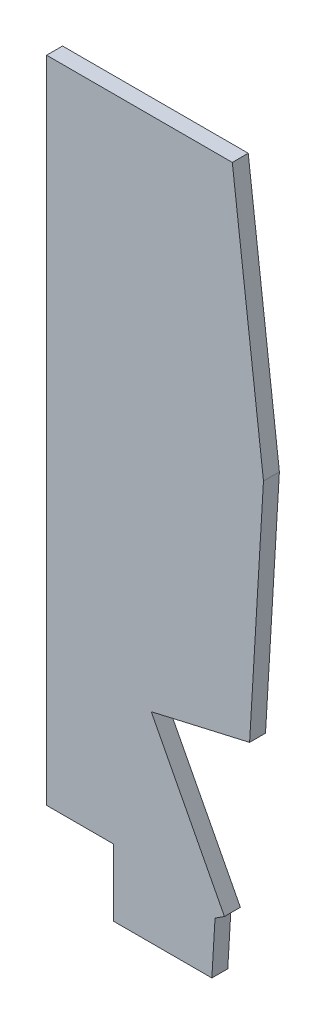
ISO-10303-21;
HEADER;
FILE_DESCRIPTION(('STEP AP214'),'2;1');
FILE_NAME('part.step','',(''),(''),'','','');
FILE_SCHEMA(('AUTOMOTIVE_DESIGN { 1 0 10303 214 1 1 1 1 }'));
ENDSEC;
DATA;
#1=APPLICATION_CONTEXT('core data for automotive mechanical design processes');
#2=APPLICATION_PROTOCOL_DEFINITION('international standard','automotive_design',2000,#1);
#3=PRODUCT_CONTEXT('',#1,'mechanical');
#4=PRODUCT('Part','Part','',(#3));
#5=PRODUCT_RELATED_PRODUCT_CATEGORY('part','',(#4));
#6=PRODUCT_DEFINITION_FORMATION('','',#4);
#7=PRODUCT_DEFINITION_CONTEXT('part definition',#1,'design');
#8=PRODUCT_DEFINITION('design','',#6,#7);
#9=PRODUCT_DEFINITION_SHAPE('','',#8);
#10=(LENGTH_UNIT() NAMED_UNIT(*) SI_UNIT(.MILLI.,.METRE.));
#11=(NAMED_UNIT(*) PLANE_ANGLE_UNIT() SI_UNIT($,.RADIAN.));
#12=(NAMED_UNIT(*) SI_UNIT($,.STERADIAN.) SOLID_ANGLE_UNIT());
#13=UNCERTAINTY_MEASURE_WITH_UNIT(LENGTH_MEASURE(1.E-05),#10,'distance_accuracy_value','');
#14=(GEOMETRIC_REPRESENTATION_CONTEXT(3) GLOBAL_UNCERTAINTY_ASSIGNED_CONTEXT((#13)) GLOBAL_UNIT_ASSIGNED_CONTEXT((#10,
#11,#12)) REPRESENTATION_CONTEXT('',''));
#15=CARTESIAN_POINT('',(0.,0.,0.));
#16=DIRECTION('',(0.,0.,1.));
#17=DIRECTION('',(1.,0.,0.));
#18=AXIS2_PLACEMENT_3D('',#15,#16,#17);
#19=CARTESIAN_POINT('',(-100.,112.5,5.));
#20=DIRECTION('',(0.,-1.,0.));
#21=DIRECTION('',(0.,0.,-1.));
#22=AXIS2_PLACEMENT_3D('',#19,#20,#21);
#23=PLANE('',#22);
#24=DIRECTION('',(-1.,0.,0.));
#25=VECTOR('',#24,1.);
#26=CARTESIAN_POINT('',(-100.,112.5,5.));
#27=LINE('',#26,#25);
#28=CARTESIAN_POINT('',(-41.6890144098652,112.5,5.));
#29=VERTEX_POINT('',#28);
#30=CARTESIAN_POINT('',(-100.,112.5,5.));
#31=VERTEX_POINT('',#30);
#32=EDGE_CURVE('E131',#29,#31,#27,.T.);
#33=ORIENTED_EDGE('',*,*,#32,.F.);
#34=DIRECTION('',(0.,0.,1.));
#35=VECTOR('',#34,1.);
#36=CARTESIAN_POINT('',(-41.6890144098652,112.5,0.));
#37=LINE('',#36,#35);
#38=CARTESIAN_POINT('',(-41.6890144098652,112.5,0.));
#39=VERTEX_POINT('',#38);
#40=EDGE_CURVE('E120',#39,#29,#37,.T.);
#41=ORIENTED_EDGE('',*,*,#40,.F.);
#42=DIRECTION('',(-1.,0.,0.));
#43=VECTOR('',#42,1.);
#44=CARTESIAN_POINT('',(-100.,112.5,0.));
#45=LINE('',#44,#43);
#46=CARTESIAN_POINT('',(-100.,112.5,0.));
#47=VERTEX_POINT('',#46);
#48=EDGE_CURVE('E130',#39,#47,#45,.T.);
#49=ORIENTED_EDGE('',*,*,#48,.T.);
#50=DIRECTION('',(0.,0.,-1.));
#51=VECTOR('',#50,1.);
#52=CARTESIAN_POINT('',(-100.,112.5,5.));
#53=LINE('',#52,#51);
#54=EDGE_CURVE('E11',#31,#47,#53,.T.);
#55=ORIENTED_EDGE('',*,*,#54,.F.);
#56=EDGE_LOOP('',(#33,#41,#49,#55));
#57=FACE_BOUND('',#56,.T.);
#58=ADVANCED_FACE('F35',(#57),#23,.F.);
#59=CARTESIAN_POINT('',(-100.,112.5,5.));
#60=DIRECTION('',(1.,0.,0.));
#61=DIRECTION('',(0.,1.,0.));
#62=AXIS2_PLACEMENT_3D('',#59,#60,#61);
#63=PLANE('',#62);
#64=DIRECTION('',(0.,-1.,0.));
#65=VECTOR('',#64,1.);
#66=CARTESIAN_POINT('',(-100.,112.5,0.));
#67=LINE('',#66,#65);
#68=CARTESIAN_POINT('',(-100.,-91.5,0.));
#69=VERTEX_POINT('',#68);
#70=EDGE_CURVE('E138',#47,#69,#67,.T.);
#71=ORIENTED_EDGE('',*,*,#70,.T.);
#72=DIRECTION('',(0.,0.,1.));
#73=VECTOR('',#72,1.);
#74=CARTESIAN_POINT('',(-100.,-91.5,0.));
#75=LINE('',#74,#73);
#76=CARTESIAN_POINT('',(-100.,-91.5,5.));
#77=VERTEX_POINT('',#76);
#78=EDGE_CURVE('E139',#69,#77,#75,.T.);
#79=ORIENTED_EDGE('',*,*,#78,.T.);
#80=DIRECTION('',(0.,-1.,0.));
#81=VECTOR('',#80,1.);
#82=CARTESIAN_POINT('',(-100.,112.5,5.));
#83=LINE('',#82,#81);
#84=EDGE_CURVE('E153',#31,#77,#83,.T.);
#85=ORIENTED_EDGE('',*,*,#84,.F.);
#86=ORIENTED_EDGE('',*,*,#54,.T.);
#87=EDGE_LOOP('',(#71,#79,#85,#86));
#88=FACE_BOUND('',#87,.T.);
#89=ADVANCED_FACE('F231',(#88),#63,.F.);
#90=CARTESIAN_POINT('',(-100.,-112.5,5.));
#91=DIRECTION('',(0.,1.,0.));
#92=DIRECTION('',(0.,0.,1.));
#93=AXIS2_PLACEMENT_3D('',#90,#91,#92);
#94=PLANE('',#93);
#95=DIRECTION('',(1.,0.,0.));
#96=VECTOR('',#95,1.);
#97=CARTESIAN_POINT('',(-100.,-112.5,0.));
#98=LINE('',#97,#96);
#99=CARTESIAN_POINT('',(-79.,-112.5,0.));
#100=VERTEX_POINT('',#99);
#101=CARTESIAN_POINT('',(-48.1142635898387,-112.5,0.));
#102=VERTEX_POINT('',#101);
#103=EDGE_CURVE('E141',#100,#102,#98,.T.);
#104=ORIENTED_EDGE('',*,*,#103,.T.);
#105=DIRECTION('',(0.,0.,1.));
#106=VECTOR('',#105,1.);
#107=CARTESIAN_POINT('',(-48.1142635898387,-112.5,0.));
#108=LINE('',#107,#106);
#109=CARTESIAN_POINT('',(-48.1142635898387,-112.5,5.));
#110=VERTEX_POINT('',#109);
#111=EDGE_CURVE('E167',#102,#110,#108,.T.);
#112=ORIENTED_EDGE('',*,*,#111,.T.);
#113=DIRECTION('',(1.,0.,0.));
#114=VECTOR('',#113,1.);
#115=CARTESIAN_POINT('',(-100.,-112.5,5.));
#116=LINE('',#115,#114);
#117=CARTESIAN_POINT('',(-79.,-112.5,5.));
#118=VERTEX_POINT('',#117);
#119=EDGE_CURVE('E42',#118,#110,#116,.T.);
#120=ORIENTED_EDGE('',*,*,#119,.F.);
#121=DIRECTION('',(0.,0.,1.));
#122=VECTOR('',#121,1.);
#123=CARTESIAN_POINT('',(-79.,-112.5,0.));
#124=LINE('',#123,#122);
#125=EDGE_CURVE('E158',#100,#118,#124,.T.);
#126=ORIENTED_EDGE('',*,*,#125,.F.);
#127=EDGE_LOOP('',(#104,#112,#120,#126));
#128=FACE_BOUND('',#127,.T.);
#129=ADVANCED_FACE('F224',(#128),#94,.F.);
#130=CARTESIAN_POINT('',(0.,0.,5.));
#131=DIRECTION('',(0.,0.,1.));
#132=DIRECTION('',(1.,0.,0.));
#133=AXIS2_PLACEMENT_3D('',#130,#131,#132);
#134=PLANE('',#133);
#135=DIRECTION('',(-0.0594132195889589,-0.998233474362623,0.));
#136=VECTOR('',#135,1.);
#137=CARTESIAN_POINT('',(-47.1150766417989,-95.712122393298,5.));
#138=LINE('',#137,#136);
#139=CARTESIAN_POINT('',(-47.1150766417989,-95.712122393298,5.));
#140=VERTEX_POINT('',#139);
#141=EDGE_CURVE('E125',#140,#110,#138,.T.);
#142=ORIENTED_EDGE('',*,*,#141,.F.);
#143=DIRECTION('',(-0.839812379223764,-0.542876751853052,0.));
#144=VECTOR('',#143,1.);
#145=CARTESIAN_POINT('',(-47.1150766417989,-95.712122393298,5.));
#146=LINE('',#145,#144);
#147=CARTESIAN_POINT('',(-44.1550648933672,-93.7986931522087,5.));
#148=VERTEX_POINT('',#147);
#149=EDGE_CURVE('E182',#148,#140,#146,.T.);
#150=ORIENTED_EDGE('',*,*,#149,.F.);
#151=DIRECTION('',(0.46142293928003,-0.887180292334189,0.));
#152=VECTOR('',#151,1.);
#153=CARTESIAN_POINT('',(-44.1550648933672,-93.7986931522087,5.));
#154=LINE('',#153,#152);
#155=CARTESIAN_POINT('',(-67.1447556794238,-49.5962947537443,5.));
#156=VERTEX_POINT('',#155);
#157=EDGE_CURVE('E185',#156,#148,#154,.T.);
#158=ORIENTED_EDGE('',*,*,#157,.F.);
#159=DIRECTION('',(-0.974634387731809,-0.223803061307573,0.));
#160=VECTOR('',#159,1.);
#161=CARTESIAN_POINT('',(-67.1447556794238,-49.5962947537443,5.));
#162=LINE('',#161,#160);
#163=CARTESIAN_POINT('',(-36.2629521779314,-42.5049769741435,5.));
#164=VERTEX_POINT('',#163);
#165=EDGE_CURVE('E188',#164,#156,#162,.T.);
#166=ORIENTED_EDGE('',*,*,#165,.F.);
#167=DIRECTION('',(-0.0594132195889583,-0.998233474362623,0.));
#168=VECTOR('',#167,1.);
#169=CARTESIAN_POINT('',(-36.2629521779314,-42.5049769741435,5.));
#170=LINE('',#169,#168);
#171=CARTESIAN_POINT('',(-31.9026723474871,30.7544308554668,5.));
#172=VERTEX_POINT('',#171);
#173=EDGE_CURVE('E191',#172,#164,#170,.T.);
#174=ORIENTED_EDGE('',*,*,#173,.F.);
#175=DIRECTION('',(0.118868304244425,-0.992910029280627,0.));
#176=VECTOR('',#175,1.);
#177=CARTESIAN_POINT('',(-31.9026723474871,30.7544308554668,5.));
#178=LINE('',#177,#176);
#179=EDGE_CURVE('E194',#29,#172,#178,.T.);
#180=ORIENTED_EDGE('',*,*,#179,.F.);
#181=ORIENTED_EDGE('',*,*,#32,.T.);
#182=ORIENTED_EDGE('',*,*,#84,.T.);
#183=DIRECTION('',(-1.,0.,0.));
#184=VECTOR('',#183,1.);
#185=CARTESIAN_POINT('',(-100.,-91.5,5.));
#186=LINE('',#185,#184);
#187=CARTESIAN_POINT('',(-79.,-91.5,5.));
#188=VERTEX_POINT('',#187);
#189=EDGE_CURVE('E161',#188,#77,#186,.T.);
#190=ORIENTED_EDGE('',*,*,#189,.F.);
#191=DIRECTION('',(0.,1.,0.));
#192=VECTOR('',#191,1.);
#193=CARTESIAN_POINT('',(-79.,-112.5,5.));
#194=LINE('',#193,#192);
#195=EDGE_CURVE('E164',#118,#188,#194,.T.);
#196=ORIENTED_EDGE('',*,*,#195,.F.);
#197=ORIENTED_EDGE('',*,*,#119,.T.);
#198=EDGE_LOOP('',(#142,#150,#158,#166,#174,#180,#181,#182,#190,#196,#197));
#199=FACE_BOUND('',#198,.T.);
#200=ADVANCED_FACE('F226',(#199),#134,.T.);
#201=CARTESIAN_POINT('',(0.,0.,0.));
#202=DIRECTION('',(0.,0.,1.));
#203=DIRECTION('',(1.,0.,0.));
#204=AXIS2_PLACEMENT_3D('',#201,#202,#203);
#205=PLANE('',#204);
#206=DIRECTION('',(-0.839812379223764,-0.542876751853052,0.));
#207=VECTOR('',#206,1.);
#208=CARTESIAN_POINT('',(-47.1150766417989,-95.712122393298,0.));
#209=LINE('',#208,#207);
#210=CARTESIAN_POINT('',(-44.1550648933672,-93.7986931522087,0.));
#211=VERTEX_POINT('',#210);
#212=CARTESIAN_POINT('',(-47.1150766417989,-95.712122393298,0.));
#213=VERTEX_POINT('',#212);
#214=EDGE_CURVE('E198',#211,#213,#209,.T.);
#215=ORIENTED_EDGE('',*,*,#214,.T.);
#216=DIRECTION('',(-0.0594132195889589,-0.998233474362623,0.));
#217=VECTOR('',#216,1.);
#218=CARTESIAN_POINT('',(-47.1150766417989,-95.712122393298,0.));
#219=LINE('',#218,#217);
#220=EDGE_CURVE('E132',#213,#102,#219,.T.);
#221=ORIENTED_EDGE('',*,*,#220,.T.);
#222=ORIENTED_EDGE('',*,*,#103,.F.);
#223=DIRECTION('',(0.,1.,0.));
#224=VECTOR('',#223,1.);
#225=CARTESIAN_POINT('',(-79.,-112.5,0.));
#226=LINE('',#225,#224);
#227=CARTESIAN_POINT('',(-79.,-91.5,0.));
#228=VERTEX_POINT('',#227);
#229=EDGE_CURVE('E163',#100,#228,#226,.T.);
#230=ORIENTED_EDGE('',*,*,#229,.T.);
#231=DIRECTION('',(-1.,0.,0.));
#232=VECTOR('',#231,1.);
#233=CARTESIAN_POINT('',(-100.,-91.5,0.));
#234=LINE('',#233,#232);
#235=EDGE_CURVE('E57',#228,#69,#234,.T.);
#236=ORIENTED_EDGE('',*,*,#235,.T.);
#237=ORIENTED_EDGE('',*,*,#70,.F.);
#238=ORIENTED_EDGE('',*,*,#48,.F.);
#239=DIRECTION('',(0.118868304244425,-0.992910029280627,0.));
#240=VECTOR('',#239,1.);
#241=CARTESIAN_POINT('',(-31.9026723474871,30.7544308554668,0.));
#242=LINE('',#241,#240);
#243=CARTESIAN_POINT('',(-31.9026723474871,30.7544308554668,0.));
#244=VERTEX_POINT('',#243);
#245=EDGE_CURVE('E116',#39,#244,#242,.T.);
#246=ORIENTED_EDGE('',*,*,#245,.T.);
#247=DIRECTION('',(-0.0594132195889583,-0.998233474362623,0.));
#248=VECTOR('',#247,1.);
#249=CARTESIAN_POINT('',(-36.2629521779314,-42.5049769741435,0.));
#250=LINE('',#249,#248);
#251=CARTESIAN_POINT('',(-36.2629521779314,-42.5049769741435,0.));
#252=VERTEX_POINT('',#251);
#253=EDGE_CURVE('E49',#244,#252,#250,.T.);
#254=ORIENTED_EDGE('',*,*,#253,.T.);
#255=DIRECTION('',(-0.974634387731809,-0.223803061307573,0.));
#256=VECTOR('',#255,1.);
#257=CARTESIAN_POINT('',(-67.1447556794238,-49.5962947537443,0.));
#258=LINE('',#257,#256);
#259=CARTESIAN_POINT('',(-67.1447556794238,-49.5962947537443,0.));
#260=VERTEX_POINT('',#259);
#261=EDGE_CURVE('E203',#252,#260,#258,.T.);
#262=ORIENTED_EDGE('',*,*,#261,.T.);
#263=DIRECTION('',(0.46142293928003,-0.887180292334189,0.));
#264=VECTOR('',#263,1.);
#265=CARTESIAN_POINT('',(-44.1550648933672,-93.7986931522087,0.));
#266=LINE('',#265,#264);
#267=EDGE_CURVE('E200',#260,#211,#266,.T.);
#268=ORIENTED_EDGE('',*,*,#267,.T.);
#269=EDGE_LOOP('',(#215,#221,#222,#230,#236,#237,#238,#246,#254,#262,#268));
#270=FACE_BOUND('',#269,.T.);
#271=ADVANCED_FACE('F136',(#270),#205,.F.);
#272=CARTESIAN_POINT('',(-100.,-91.5,0.));
#273=DIRECTION('',(0.,1.,0.));
#274=DIRECTION('',(0.,0.,1.));
#275=AXIS2_PLACEMENT_3D('',#272,#273,#274);
#276=PLANE('',#275);
#277=ORIENTED_EDGE('',*,*,#189,.T.);
#278=ORIENTED_EDGE('',*,*,#78,.F.);
#279=ORIENTED_EDGE('',*,*,#235,.F.);
#280=DIRECTION('',(0.,0.,1.));
#281=VECTOR('',#280,1.);
#282=CARTESIAN_POINT('',(-79.,-91.5,0.));
#283=LINE('',#282,#281);
#284=EDGE_CURVE('E144',#228,#188,#283,.T.);
#285=ORIENTED_EDGE('',*,*,#284,.T.);
#286=EDGE_LOOP('',(#277,#278,#279,#285));
#287=FACE_BOUND('',#286,.T.);
#288=ADVANCED_FACE('F233',(#287),#276,.F.);
#289=CARTESIAN_POINT('',(-79.,-112.5,0.));
#290=DIRECTION('',(1.,0.,0.));
#291=DIRECTION('',(0.,0.,-1.));
#292=AXIS2_PLACEMENT_3D('',#289,#290,#291);
#293=PLANE('',#292);
#294=ORIENTED_EDGE('',*,*,#195,.T.);
#295=ORIENTED_EDGE('',*,*,#284,.F.);
#296=ORIENTED_EDGE('',*,*,#229,.F.);
#297=ORIENTED_EDGE('',*,*,#125,.T.);
#298=EDGE_LOOP('',(#294,#295,#296,#297));
#299=FACE_BOUND('',#298,.T.);
#300=ADVANCED_FACE('F229',(#299),#293,.F.);
#301=CARTESIAN_POINT('',(-47.1150766417989,-95.712122393298,0.));
#302=DIRECTION('',(-0.998233474362623,0.0594132195889589,0.));
#303=DIRECTION('',(-0.0594132195889589,-0.998233474362623,0.));
#304=AXIS2_PLACEMENT_3D('',#301,#302,#303);
#305=PLANE('',#304);
#306=ORIENTED_EDGE('',*,*,#141,.T.);
#307=ORIENTED_EDGE('',*,*,#111,.F.);
#308=ORIENTED_EDGE('',*,*,#220,.F.);
#309=DIRECTION('',(0.,0.,1.));
#310=VECTOR('',#309,1.);
#311=CARTESIAN_POINT('',(-47.1150766417989,-95.712122393298,0.));
#312=LINE('',#311,#310);
#313=EDGE_CURVE('E178',#213,#140,#312,.T.);
#314=ORIENTED_EDGE('',*,*,#313,.T.);
#315=EDGE_LOOP('',(#306,#307,#308,#314));
#316=FACE_BOUND('',#315,.T.);
#317=ADVANCED_FACE('F220',(#316),#305,.F.);
#318=CARTESIAN_POINT('',(-47.1150766417989,-95.712122393298,0.));
#319=DIRECTION('',(-0.542876751853052,0.839812379223764,0.));
#320=DIRECTION('',(-0.839812379223764,-0.542876751853052,0.));
#321=AXIS2_PLACEMENT_3D('',#318,#319,#320);
#322=PLANE('',#321);
#323=ORIENTED_EDGE('',*,*,#149,.T.);
#324=ORIENTED_EDGE('',*,*,#313,.F.);
#325=ORIENTED_EDGE('',*,*,#214,.F.);
#326=DIRECTION('',(0.,0.,1.));
#327=VECTOR('',#326,1.);
#328=CARTESIAN_POINT('',(-44.1550648933672,-93.7986931522087,0.));
#329=LINE('',#328,#327);
#330=EDGE_CURVE('E176',#211,#148,#329,.T.);
#331=ORIENTED_EDGE('',*,*,#330,.T.);
#332=EDGE_LOOP('',(#323,#324,#325,#331));
#333=FACE_BOUND('',#332,.T.);
#334=ADVANCED_FACE('F217',(#333),#322,.F.);
#335=CARTESIAN_POINT('',(-44.1550648933672,-93.7986931522087,0.));
#336=DIRECTION('',(-0.887180292334189,-0.46142293928003,0.));
#337=DIRECTION('',(0.46142293928003,-0.887180292334189,0.));
#338=AXIS2_PLACEMENT_3D('',#335,#336,#337);
#339=PLANE('',#338);
#340=ORIENTED_EDGE('',*,*,#157,.T.);
#341=ORIENTED_EDGE('',*,*,#330,.F.);
#342=ORIENTED_EDGE('',*,*,#267,.F.);
#343=DIRECTION('',(0.,0.,1.));
#344=VECTOR('',#343,1.);
#345=CARTESIAN_POINT('',(-67.1447556794238,-49.5962947537443,0.));
#346=LINE('',#345,#344);
#347=EDGE_CURVE('E174',#260,#156,#346,.T.);
#348=ORIENTED_EDGE('',*,*,#347,.T.);
#349=EDGE_LOOP('',(#340,#341,#342,#348));
#350=FACE_BOUND('',#349,.T.);
#351=ADVANCED_FACE('F213',(#350),#339,.F.);
#352=CARTESIAN_POINT('',(-67.1447556794238,-49.5962947537443,0.));
#353=DIRECTION('',(-0.223803061307573,0.974634387731809,0.));
#354=DIRECTION('',(-0.974634387731809,-0.223803061307573,0.));
#355=AXIS2_PLACEMENT_3D('',#352,#353,#354);
#356=PLANE('',#355);
#357=ORIENTED_EDGE('',*,*,#165,.T.);
#358=ORIENTED_EDGE('',*,*,#347,.F.);
#359=ORIENTED_EDGE('',*,*,#261,.F.);
#360=DIRECTION('',(0.,0.,1.));
#361=VECTOR('',#360,1.);
#362=CARTESIAN_POINT('',(-36.2629521779314,-42.5049769741435,0.));
#363=LINE('',#362,#361);
#364=EDGE_CURVE('E172',#252,#164,#363,.T.);
#365=ORIENTED_EDGE('',*,*,#364,.T.);
#366=EDGE_LOOP('',(#357,#358,#359,#365));
#367=FACE_BOUND('',#366,.T.);
#368=ADVANCED_FACE('F209',(#367),#356,.F.);
#369=CARTESIAN_POINT('',(-36.2629521779314,-42.5049769741435,0.));
#370=DIRECTION('',(-0.998233474362623,0.0594132195889583,0.));
#371=DIRECTION('',(-0.0594132195889583,-0.998233474362623,0.));
#372=AXIS2_PLACEMENT_3D('',#369,#370,#371);
#373=PLANE('',#372);
#374=ORIENTED_EDGE('',*,*,#173,.T.);
#375=ORIENTED_EDGE('',*,*,#364,.F.);
#376=ORIENTED_EDGE('',*,*,#253,.F.);
#377=DIRECTION('',(0.,0.,1.));
#378=VECTOR('',#377,1.);
#379=CARTESIAN_POINT('',(-31.9026723474871,30.7544308554668,0.));
#380=LINE('',#379,#378);
#381=EDGE_CURVE('E122',#244,#172,#380,.T.);
#382=ORIENTED_EDGE('',*,*,#381,.T.);
#383=EDGE_LOOP('',(#374,#375,#376,#382));
#384=FACE_BOUND('',#383,.T.);
#385=ADVANCED_FACE('F296',(#384),#373,.F.);
#386=CARTESIAN_POINT('',(-31.9026723474871,30.7544308554668,0.));
#387=DIRECTION('',(-0.992910029280627,-0.118868304244425,0.));
#388=DIRECTION('',(0.118868304244425,-0.992910029280627,0.));
#389=AXIS2_PLACEMENT_3D('',#386,#387,#388);
#390=PLANE('',#389);
#391=ORIENTED_EDGE('',*,*,#179,.T.);
#392=ORIENTED_EDGE('',*,*,#381,.F.);
#393=ORIENTED_EDGE('',*,*,#245,.F.);
#394=ORIENTED_EDGE('',*,*,#40,.T.);
#395=EDGE_LOOP('',(#391,#392,#393,#394));
#396=FACE_BOUND('',#395,.T.);
#397=ADVANCED_FACE('F119',(#396),#390,.F.);
#398=CLOSED_SHELL('',(#58,#89,#129,#200,#271,#288,#300,#317,#334,#351,#368,#385,#397));
#399=MANIFOLD_SOLID_BREP('B2',#398);
#400=ADVANCED_BREP_SHAPE_REPRESENTATION('',(#18,#399),#14);
#401=SHAPE_DEFINITION_REPRESENTATION(#9,#400);
ENDSEC;
END-ISO-10303-21;
